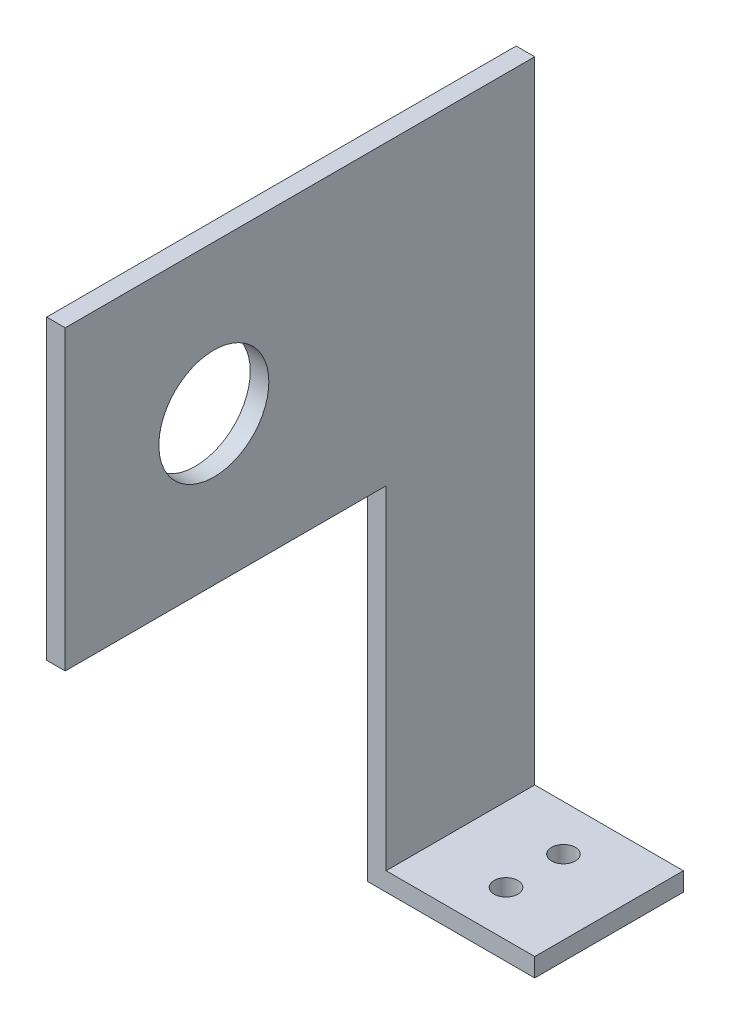
ISO-10303-21;
HEADER;
FILE_DESCRIPTION(('STEP AP214'),'2;1');
FILE_NAME('part.step','',(''),(''),'','','');
FILE_SCHEMA(('AUTOMOTIVE_DESIGN { 1 0 10303 214 1 1 1 1 }'));
ENDSEC;
DATA;
#1=APPLICATION_CONTEXT('core data for automotive mechanical design processes');
#2=APPLICATION_PROTOCOL_DEFINITION('international standard','automotive_design',2000,#1);
#3=PRODUCT_CONTEXT('',#1,'mechanical');
#4=PRODUCT('Part','Part','',(#3));
#5=PRODUCT_RELATED_PRODUCT_CATEGORY('part','',(#4));
#6=PRODUCT_DEFINITION_FORMATION('','',#4);
#7=PRODUCT_DEFINITION_CONTEXT('part definition',#1,'design');
#8=PRODUCT_DEFINITION('design','',#6,#7);
#9=PRODUCT_DEFINITION_SHAPE('','',#8);
#10=(LENGTH_UNIT() NAMED_UNIT(*) SI_UNIT(.MILLI.,.METRE.));
#11=(NAMED_UNIT(*) PLANE_ANGLE_UNIT() SI_UNIT($,.RADIAN.));
#12=(NAMED_UNIT(*) SI_UNIT($,.STERADIAN.) SOLID_ANGLE_UNIT());
#13=UNCERTAINTY_MEASURE_WITH_UNIT(LENGTH_MEASURE(1.E-05),#10,'distance_accuracy_value','');
#14=(GEOMETRIC_REPRESENTATION_CONTEXT(3) GLOBAL_UNCERTAINTY_ASSIGNED_CONTEXT((#13)) GLOBAL_UNIT_ASSIGNED_CONTEXT((#10,
#11,#12)) REPRESENTATION_CONTEXT('',''));
#15=CARTESIAN_POINT('',(0.,0.,0.));
#16=DIRECTION('',(0.,0.,1.));
#17=DIRECTION('',(1.,0.,0.));
#18=AXIS2_PLACEMENT_3D('',#15,#16,#17);
#19=CARTESIAN_POINT('',(15.875,-85.5575951024,-37.2309428523334));
#20=DIRECTION('',(0.,1.,0.));
#21=DIRECTION('',(0.,0.,1.));
#22=AXIS2_PLACEMENT_3D('',#19,#20,#21);
#23=CYLINDRICAL_SURFACE('',#22,2.032);
#24=CARTESIAN_POINT('',(15.875,-85.5575951024,-37.2309428523334));
#25=DIRECTION('',(0.,1.,0.));
#26=DIRECTION('',(0.,0.,1.));
#27=AXIS2_PLACEMENT_3D('',#24,#25,#26);
#28=CIRCLE('',#27,2.032);
#29=CARTESIAN_POINT('',(15.875,-85.5575951024,-35.1989428523334));
#30=VERTEX_POINT('',#29);
#31=EDGE_CURVE('E123',#30,#30,#28,.T.);
#32=ORIENTED_EDGE('',*,*,#31,.F.);
#33=EDGE_LOOP('',(#32));
#34=FACE_BOUND('',#33,.T.);
#35=CARTESIAN_POINT('',(15.875,-82.3825951024,-37.2309428523334));
#36=DIRECTION('',(0.,1.,0.));
#37=DIRECTION('',(0.,0.,1.));
#38=AXIS2_PLACEMENT_3D('',#35,#36,#37);
#39=CIRCLE('',#38,2.032);
#40=CARTESIAN_POINT('',(15.875,-82.3825951024,-35.1989428523334));
#41=VERTEX_POINT('',#40);
#42=EDGE_CURVE('E114',#41,#41,#39,.F.);
#43=ORIENTED_EDGE('',*,*,#42,.F.);
#44=EDGE_LOOP('',(#43));
#45=FACE_BOUND('',#44,.T.);
#46=ADVANCED_FACE('F17',(#34,#45),#23,.F.);
#47=CARTESIAN_POINT('',(15.875,-85.5575951024,-47.0522761856666));
#48=DIRECTION('',(0.,1.,0.));
#49=DIRECTION('',(0.,0.,1.));
#50=AXIS2_PLACEMENT_3D('',#47,#48,#49);
#51=CYLINDRICAL_SURFACE('',#50,2.032);
#52=CARTESIAN_POINT('',(15.875,-85.5575951024,-47.0522761856666));
#53=DIRECTION('',(0.,1.,0.));
#54=DIRECTION('',(0.,0.,1.));
#55=AXIS2_PLACEMENT_3D('',#52,#53,#54);
#56=CIRCLE('',#55,2.032);
#57=CARTESIAN_POINT('',(15.875,-85.5575951024,-45.0202761856666));
#58=VERTEX_POINT('',#57);
#59=EDGE_CURVE('E120',#58,#58,#56,.T.);
#60=ORIENTED_EDGE('',*,*,#59,.F.);
#61=EDGE_LOOP('',(#60));
#62=FACE_BOUND('',#61,.T.);
#63=CARTESIAN_POINT('',(15.875,-82.3825951024,-47.0522761856666));
#64=DIRECTION('',(0.,1.,0.));
#65=DIRECTION('',(0.,0.,1.));
#66=AXIS2_PLACEMENT_3D('',#63,#64,#65);
#67=CIRCLE('',#66,2.032);
#68=CARTESIAN_POINT('',(15.875,-82.3825951024,-45.0202761856666));
#69=VERTEX_POINT('',#68);
#70=EDGE_CURVE('E20',#69,#69,#67,.F.);
#71=ORIENTED_EDGE('',*,*,#70,.F.);
#72=EDGE_LOOP('',(#71));
#73=FACE_BOUND('',#72,.T.);
#74=ADVANCED_FACE('F135',(#62,#73),#51,.F.);
#75=CARTESIAN_POINT('',(15.875,-82.3825951024,-42.141609519));
#76=DIRECTION('',(0.,1.,0.));
#77=DIRECTION('',(0.,0.,1.));
#78=AXIS2_PLACEMENT_3D('',#75,#76,#77);
#79=PLANE('',#78);
#80=ORIENTED_EDGE('',*,*,#42,.T.);
#81=EDGE_LOOP('',(#80));
#82=FACE_BOUND('',#81,.T.);
#83=ORIENTED_EDGE('',*,*,#70,.T.);
#84=EDGE_LOOP('',(#83));
#85=FACE_BOUND('',#84,.T.);
#86=DIRECTION('',(1.,0.,0.));
#87=VECTOR('',#86,1.);
#88=CARTESIAN_POINT('',(3.175,-82.3825951024,-54.841609519));
#89=LINE('',#88,#87);
#90=CARTESIAN_POINT('',(3.175,-82.3825951024,-54.841609519));
#91=VERTEX_POINT('',#90);
#92=CARTESIAN_POINT('',(28.575,-82.3825951024,-54.841609519));
#93=VERTEX_POINT('',#92);
#94=EDGE_CURVE('E222',#91,#93,#89,.T.);
#95=ORIENTED_EDGE('',*,*,#94,.F.);
#96=DIRECTION('',(0.,0.,-1.));
#97=VECTOR('',#96,1.);
#98=CARTESIAN_POINT('',(3.175,-82.3825951024,-146.05));
#99=LINE('',#98,#97);
#100=CARTESIAN_POINT('',(3.175,-82.3825951024,-29.441609519));
#101=VERTEX_POINT('',#100);
#102=EDGE_CURVE('E103',#101,#91,#99,.T.);
#103=ORIENTED_EDGE('',*,*,#102,.F.);
#104=DIRECTION('',(1.,0.,0.));
#105=VECTOR('',#104,1.);
#106=CARTESIAN_POINT('',(3.175,-82.3825951024,-29.441609519));
#107=LINE('',#106,#105);
#108=CARTESIAN_POINT('',(28.575,-82.3825951024,-29.441609519));
#109=VERTEX_POINT('',#108);
#110=EDGE_CURVE('E196',#109,#101,#107,.F.);
#111=ORIENTED_EDGE('',*,*,#110,.F.);
#112=DIRECTION('',(0.,0.,-1.));
#113=VECTOR('',#112,1.);
#114=CARTESIAN_POINT('',(28.575,-82.3825951024,-29.441609519));
#115=LINE('',#114,#113);
#116=EDGE_CURVE('E113',#93,#109,#115,.F.);
#117=ORIENTED_EDGE('',*,*,#116,.F.);
#118=EDGE_LOOP('',(#95,#103,#111,#117));
#119=FACE_BOUND('',#118,.T.);
#120=ADVANCED_FACE('F132',(#82,#85,#119),#79,.T.);
#121=CARTESIAN_POINT('',(28.575,-85.5575951024,-29.441609519));
#122=DIRECTION('',(1.,0.,0.));
#123=DIRECTION('',(0.,0.,-1.));
#124=AXIS2_PLACEMENT_3D('',#121,#122,#123);
#125=PLANE('',#124);
#126=ORIENTED_EDGE('',*,*,#116,.T.);
#127=DIRECTION('',(0.,-1.,0.));
#128=VECTOR('',#127,1.);
#129=CARTESIAN_POINT('',(28.575,-85.5575951024,-29.441609519));
#130=LINE('',#129,#128);
#131=CARTESIAN_POINT('',(28.575,-85.5575951024,-29.441609519));
#132=VERTEX_POINT('',#131);
#133=EDGE_CURVE('E189',#132,#109,#130,.F.);
#134=ORIENTED_EDGE('',*,*,#133,.F.);
#135=DIRECTION('',(0.,0.,-1.));
#136=VECTOR('',#135,1.);
#137=CARTESIAN_POINT('',(28.575,-85.5575951024,-54.841609519));
#138=LINE('',#137,#136);
#139=CARTESIAN_POINT('',(28.575,-85.5575951024,-54.841609519));
#140=VERTEX_POINT('',#139);
#141=EDGE_CURVE('E125',#140,#132,#138,.F.);
#142=ORIENTED_EDGE('',*,*,#141,.F.);
#143=DIRECTION('',(0.,1.,0.));
#144=VECTOR('',#143,1.);
#145=CARTESIAN_POINT('',(28.575,-25.4,-54.841609519));
#146=LINE('',#145,#144);
#147=EDGE_CURVE('E191',#93,#140,#146,.F.);
#148=ORIENTED_EDGE('',*,*,#147,.F.);
#149=EDGE_LOOP('',(#126,#134,#142,#148));
#150=FACE_BOUND('',#149,.T.);
#151=ADVANCED_FACE('F143',(#150),#125,.T.);
#152=CARTESIAN_POINT('',(3.175,0.,-146.05));
#153=DIRECTION('',(1.,0.,0.));
#154=DIRECTION('',(0.,0.,-1.));
#155=AXIS2_PLACEMENT_3D('',#152,#153,#154);
#156=PLANE('',#155);
#157=CARTESIAN_POINT('',(3.175,0.,0.));
#158=DIRECTION('',(1.,0.,0.));
#159=DIRECTION('',(0.,0.,-1.));
#160=AXIS2_PLACEMENT_3D('',#157,#158,#159);
#161=CIRCLE('',#160,9.398);
#162=CARTESIAN_POINT('',(3.175,0.,-9.398));
#163=VERTEX_POINT('',#162);
#164=EDGE_CURVE('E116',#163,#163,#161,.F.);
#165=ORIENTED_EDGE('',*,*,#164,.T.);
#166=EDGE_LOOP('',(#165));
#167=FACE_BOUND('',#166,.T.);
#168=DIRECTION('',(0.,-1.,0.));
#169=VECTOR('',#168,1.);
#170=CARTESIAN_POINT('',(3.175,-85.5575951024,-29.441609519));
#171=LINE('',#170,#169);
#172=CARTESIAN_POINT('',(3.175,-25.4,-29.441609519));
#173=VERTEX_POINT('',#172);
#174=EDGE_CURVE('E206',#101,#173,#171,.F.);
#175=ORIENTED_EDGE('',*,*,#174,.F.);
#176=ORIENTED_EDGE('',*,*,#102,.T.);
#177=DIRECTION('',(0.,1.,0.));
#178=VECTOR('',#177,1.);
#179=CARTESIAN_POINT('',(3.175,-25.4,-54.841609519));
#180=LINE('',#179,#178);
#181=CARTESIAN_POINT('',(3.175,25.4,-54.841609519));
#182=VERTEX_POINT('',#181);
#183=EDGE_CURVE('E99',#182,#91,#180,.F.);
#184=ORIENTED_EDGE('',*,*,#183,.F.);
#185=DIRECTION('',(0.,0.,1.));
#186=VECTOR('',#185,1.);
#187=CARTESIAN_POINT('',(3.175,25.4000000000003,-317.5));
#188=LINE('',#187,#186);
#189=CARTESIAN_POINT('',(3.175,25.4,25.4));
#190=VERTEX_POINT('',#189);
#191=EDGE_CURVE('E93',#190,#182,#188,.F.);
#192=ORIENTED_EDGE('',*,*,#191,.F.);
#193=DIRECTION('',(0.,-1.,0.));
#194=VECTOR('',#193,1.);
#195=CARTESIAN_POINT('',(3.175,25.4,25.4));
#196=LINE('',#195,#194);
#197=CARTESIAN_POINT('',(3.175,-25.4,25.4));
#198=VERTEX_POINT('',#197);
#199=EDGE_CURVE('E84',#198,#190,#196,.F.);
#200=ORIENTED_EDGE('',*,*,#199,.F.);
#201=DIRECTION('',(0.,0.,-1.));
#202=VECTOR('',#201,1.);
#203=CARTESIAN_POINT('',(3.175,-25.4,25.4));
#204=LINE('',#203,#202);
#205=EDGE_CURVE('E79',#173,#198,#204,.F.);
#206=ORIENTED_EDGE('',*,*,#205,.F.);
#207=EDGE_LOOP('',(#175,#176,#184,#192,#200,#206));
#208=FACE_BOUND('',#207,.T.);
#209=ADVANCED_FACE('F97',(#167,#208),#156,.T.);
#210=CARTESIAN_POINT('',(0.,25.4000000000003,-317.5));
#211=DIRECTION('',(0.,1.,0.));
#212=DIRECTION('',(0.,0.,1.));
#213=AXIS2_PLACEMENT_3D('',#210,#211,#212);
#214=PLANE('',#213);
#215=DIRECTION('',(1.,0.,0.));
#216=VECTOR('',#215,1.);
#217=CARTESIAN_POINT('',(0.,25.4,25.4));
#218=LINE('',#217,#216);
#219=CARTESIAN_POINT('',(0.,25.4000000000001,25.4));
#220=VERTEX_POINT('',#219);
#221=EDGE_CURVE('E89',#190,#220,#218,.F.);
#222=ORIENTED_EDGE('',*,*,#221,.F.);
#223=ORIENTED_EDGE('',*,*,#191,.T.);
#224=DIRECTION('',(1.,0.,0.));
#225=VECTOR('',#224,1.);
#226=CARTESIAN_POINT('',(3.175,25.4,-54.841609519));
#227=LINE('',#226,#225);
#228=CARTESIAN_POINT('',(0.,25.4000000000001,-54.841609519));
#229=VERTEX_POINT('',#228);
#230=EDGE_CURVE('E119',#229,#182,#227,.T.);
#231=ORIENTED_EDGE('',*,*,#230,.F.);
#232=DIRECTION('',(0.,0.,-1.));
#233=VECTOR('',#232,1.);
#234=CARTESIAN_POINT('',(0.,25.4,-146.05));
#235=LINE('',#234,#233);
#236=EDGE_CURVE('E107',#229,#220,#235,.F.);
#237=ORIENTED_EDGE('',*,*,#236,.T.);
#238=EDGE_LOOP('',(#222,#223,#231,#237));
#239=FACE_BOUND('',#238,.T.);
#240=ADVANCED_FACE('F106',(#239),#214,.T.);
#241=CARTESIAN_POINT('',(0.,25.4,25.4));
#242=DIRECTION('',(0.,0.,1.));
#243=DIRECTION('',(0.,-1.,0.));
#244=AXIS2_PLACEMENT_3D('',#241,#242,#243);
#245=PLANE('',#244);
#246=ORIENTED_EDGE('',*,*,#199,.T.);
#247=ORIENTED_EDGE('',*,*,#221,.T.);
#248=DIRECTION('',(0.,1.,0.));
#249=VECTOR('',#248,1.);
#250=CARTESIAN_POINT('',(0.,0.,25.4));
#251=LINE('',#250,#249);
#252=CARTESIAN_POINT('',(0.,-25.4,25.4));
#253=VERTEX_POINT('',#252);
#254=EDGE_CURVE('E212',#220,#253,#251,.F.);
#255=ORIENTED_EDGE('',*,*,#254,.T.);
#256=DIRECTION('',(1.,0.,0.));
#257=VECTOR('',#256,1.);
#258=CARTESIAN_POINT('',(0.,-25.4,25.4));
#259=LINE('',#258,#257);
#260=EDGE_CURVE('E91',#198,#253,#259,.F.);
#261=ORIENTED_EDGE('',*,*,#260,.F.);
#262=EDGE_LOOP('',(#246,#247,#255,#261));
#263=FACE_BOUND('',#262,.T.);
#264=ADVANCED_FACE('F86',(#263),#245,.T.);
#265=CARTESIAN_POINT('',(0.,-25.4,25.4));
#266=DIRECTION('',(0.,-1.,0.));
#267=DIRECTION('',(0.,0.,-1.));
#268=AXIS2_PLACEMENT_3D('',#265,#266,#267);
#269=PLANE('',#268);
#270=ORIENTED_EDGE('',*,*,#260,.T.);
#271=DIRECTION('',(0.,0.,-1.));
#272=VECTOR('',#271,1.);
#273=CARTESIAN_POINT('',(0.,-25.4,-146.05));
#274=LINE('',#273,#272);
#275=CARTESIAN_POINT('',(0.,-25.4,-29.441609519));
#276=VERTEX_POINT('',#275);
#277=EDGE_CURVE('E209',#253,#276,#274,.T.);
#278=ORIENTED_EDGE('',*,*,#277,.T.);
#279=DIRECTION('',(1.,0.,0.));
#280=VECTOR('',#279,1.);
#281=CARTESIAN_POINT('',(3.175,-25.4,-29.441609519));
#282=LINE('',#281,#280);
#283=EDGE_CURVE('E199',#173,#276,#282,.F.);
#284=ORIENTED_EDGE('',*,*,#283,.F.);
#285=ORIENTED_EDGE('',*,*,#205,.T.);
#286=EDGE_LOOP('',(#270,#278,#284,#285));
#287=FACE_BOUND('',#286,.T.);
#288=ADVANCED_FACE('F170',(#287),#269,.T.);
#289=CARTESIAN_POINT('',(3.175,-85.5575951024,-29.441609519));
#290=DIRECTION('',(0.,0.,1.));
#291=DIRECTION('',(0.,-1.,0.));
#292=AXIS2_PLACEMENT_3D('',#289,#290,#291);
#293=PLANE('',#292);
#294=ORIENTED_EDGE('',*,*,#133,.T.);
#295=ORIENTED_EDGE('',*,*,#110,.T.);
#296=ORIENTED_EDGE('',*,*,#174,.T.);
#297=ORIENTED_EDGE('',*,*,#283,.T.);
#298=DIRECTION('',(0.,1.,0.));
#299=VECTOR('',#298,1.);
#300=CARTESIAN_POINT('',(0.,0.,-29.441609519));
#301=LINE('',#300,#299);
#302=CARTESIAN_POINT('',(0.,-85.5575951024,-29.441609519));
#303=VERTEX_POINT('',#302);
#304=EDGE_CURVE('E213',#276,#303,#301,.F.);
#305=ORIENTED_EDGE('',*,*,#304,.T.);
#306=DIRECTION('',(1.,0.,0.));
#307=VECTOR('',#306,1.);
#308=CARTESIAN_POINT('',(3.175,-85.5575951024,-29.441609519));
#309=LINE('',#308,#307);
#310=EDGE_CURVE('E198',#132,#303,#309,.F.);
#311=ORIENTED_EDGE('',*,*,#310,.F.);
#312=EDGE_LOOP('',(#294,#295,#296,#297,#305,#311));
#313=FACE_BOUND('',#312,.T.);
#314=ADVANCED_FACE('F166',(#313),#293,.T.);
#315=CARTESIAN_POINT('',(3.175,-85.5575951024,-54.841609519));
#316=DIRECTION('',(0.,-1.,0.));
#317=DIRECTION('',(0.,0.,-1.));
#318=AXIS2_PLACEMENT_3D('',#315,#316,#317);
#319=PLANE('',#318);
#320=ORIENTED_EDGE('',*,*,#59,.T.);
#321=EDGE_LOOP('',(#320));
#322=FACE_BOUND('',#321,.T.);
#323=ORIENTED_EDGE('',*,*,#31,.T.);
#324=EDGE_LOOP('',(#323));
#325=FACE_BOUND('',#324,.T.);
#326=DIRECTION('',(1.,0.,0.));
#327=VECTOR('',#326,1.);
#328=CARTESIAN_POINT('',(3.175,-85.5575951024,-54.841609519));
#329=LINE('',#328,#327);
#330=CARTESIAN_POINT('',(0.,-85.5575951024,-54.841609519));
#331=VERTEX_POINT('',#330);
#332=EDGE_CURVE('E35',#140,#331,#329,.F.);
#333=ORIENTED_EDGE('',*,*,#332,.F.);
#334=ORIENTED_EDGE('',*,*,#141,.T.);
#335=ORIENTED_EDGE('',*,*,#310,.T.);
#336=DIRECTION('',(0.,0.,-1.));
#337=VECTOR('',#336,1.);
#338=CARTESIAN_POINT('',(0.,-85.5575951024,-146.05));
#339=LINE('',#338,#337);
#340=EDGE_CURVE('E226',#303,#331,#339,.T.);
#341=ORIENTED_EDGE('',*,*,#340,.T.);
#342=EDGE_LOOP('',(#333,#334,#335,#341));
#343=FACE_BOUND('',#342,.T.);
#344=ADVANCED_FACE('F163',(#322,#325,#343),#319,.T.);
#345=CARTESIAN_POINT('',(3.175,-25.4,-54.841609519));
#346=DIRECTION('',(0.,0.,-1.));
#347=DIRECTION('',(0.,1.,0.));
#348=AXIS2_PLACEMENT_3D('',#345,#346,#347);
#349=PLANE('',#348);
#350=DIRECTION('',(0.,1.,0.));
#351=VECTOR('',#350,1.);
#352=CARTESIAN_POINT('',(0.,0.,-54.841609519));
#353=LINE('',#352,#351);
#354=EDGE_CURVE('E26',#331,#229,#353,.T.);
#355=ORIENTED_EDGE('',*,*,#354,.T.);
#356=ORIENTED_EDGE('',*,*,#230,.T.);
#357=ORIENTED_EDGE('',*,*,#183,.T.);
#358=ORIENTED_EDGE('',*,*,#94,.T.);
#359=ORIENTED_EDGE('',*,*,#147,.T.);
#360=ORIENTED_EDGE('',*,*,#332,.T.);
#361=EDGE_LOOP('',(#355,#356,#357,#358,#359,#360));
#362=FACE_BOUND('',#361,.T.);
#363=ADVANCED_FACE('F155',(#362),#349,.T.);
#364=CARTESIAN_POINT('',(0.,0.,0.));
#365=DIRECTION('',(1.,0.,0.));
#366=DIRECTION('',(0.,0.,-1.));
#367=AXIS2_PLACEMENT_3D('',#364,#365,#366);
#368=CYLINDRICAL_SURFACE('',#367,9.398);
#369=CARTESIAN_POINT('',(0.,0.,0.));
#370=DIRECTION('',(1.,0.,0.));
#371=DIRECTION('',(0.,0.,-1.));
#372=AXIS2_PLACEMENT_3D('',#369,#370,#371);
#373=CIRCLE('',#372,9.398);
#374=CARTESIAN_POINT('',(0.,0.,-9.398));
#375=VERTEX_POINT('',#374);
#376=EDGE_CURVE('E11',#375,#375,#373,.F.);
#377=ORIENTED_EDGE('',*,*,#376,.T.);
#378=EDGE_LOOP('',(#377));
#379=FACE_BOUND('',#378,.T.);
#380=ORIENTED_EDGE('',*,*,#164,.F.);
#381=EDGE_LOOP('',(#380));
#382=FACE_BOUND('',#381,.T.);
#383=ADVANCED_FACE('F149',(#379,#382),#368,.F.);
#384=CARTESIAN_POINT('',(0.,0.,-146.05));
#385=DIRECTION('',(1.,0.,0.));
#386=DIRECTION('',(0.,0.,-1.));
#387=AXIS2_PLACEMENT_3D('',#384,#385,#386);
#388=PLANE('',#387);
#389=ORIENTED_EDGE('',*,*,#376,.F.);
#390=EDGE_LOOP('',(#389));
#391=FACE_BOUND('',#390,.T.);
#392=ORIENTED_EDGE('',*,*,#340,.F.);
#393=ORIENTED_EDGE('',*,*,#304,.F.);
#394=ORIENTED_EDGE('',*,*,#277,.F.);
#395=ORIENTED_EDGE('',*,*,#254,.F.);
#396=ORIENTED_EDGE('',*,*,#236,.F.);
#397=ORIENTED_EDGE('',*,*,#354,.F.);
#398=EDGE_LOOP('',(#392,#393,#394,#395,#396,#397));
#399=FACE_BOUND('',#398,.T.);
#400=ADVANCED_FACE('F147',(#391,#399),#388,.F.);
#401=CLOSED_SHELL('',(#46,#74,#120,#151,#209,#240,#264,#288,#314,#344,#363,#383,#400));
#402=MANIFOLD_SOLID_BREP('B1',#401);
#403=ADVANCED_BREP_SHAPE_REPRESENTATION('',(#18,#402),#14);
#404=SHAPE_DEFINITION_REPRESENTATION(#9,#403);
ENDSEC;
END-ISO-10303-21;
